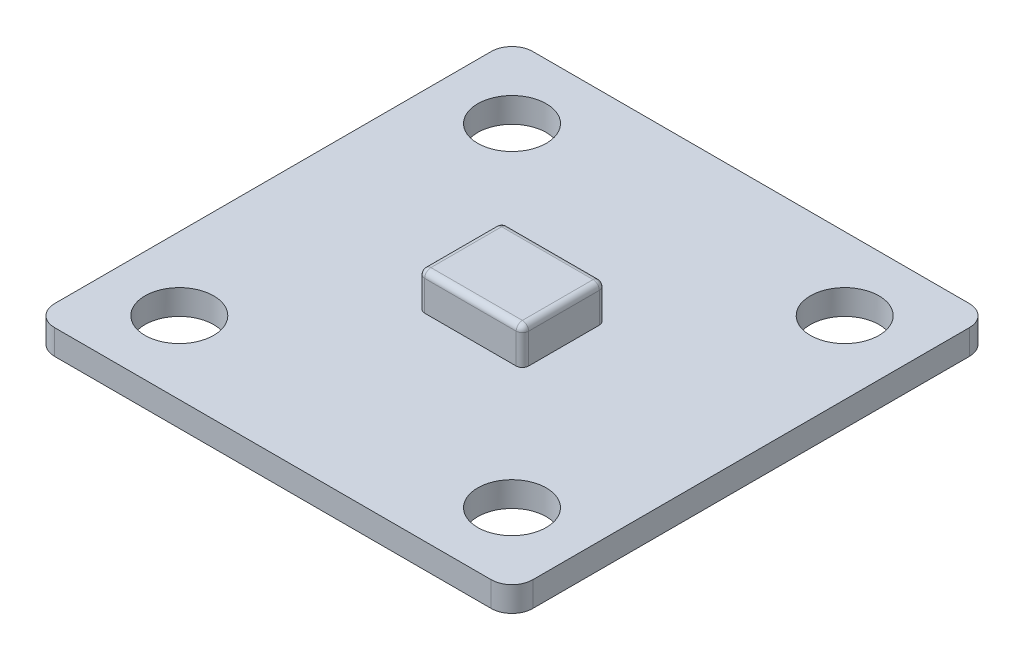
ISO-10303-21;
HEADER;
FILE_DESCRIPTION(('STEP AP214'),'2;1');
FILE_NAME('part.step','',(''),(''),'','','');
FILE_SCHEMA(('AUTOMOTIVE_DESIGN { 1 0 10303 214 1 1 1 1 }'));
ENDSEC;
DATA;
#1=APPLICATION_CONTEXT('core data for automotive mechanical design processes');
#2=APPLICATION_PROTOCOL_DEFINITION('international standard','automotive_design',2000,#1);
#3=PRODUCT_CONTEXT('',#1,'mechanical');
#4=PRODUCT('Part','Part','',(#3));
#5=PRODUCT_RELATED_PRODUCT_CATEGORY('part','',(#4));
#6=PRODUCT_DEFINITION_FORMATION('','',#4);
#7=PRODUCT_DEFINITION_CONTEXT('part definition',#1,'design');
#8=PRODUCT_DEFINITION('design','',#6,#7);
#9=PRODUCT_DEFINITION_SHAPE('','',#8);
#10=(LENGTH_UNIT() NAMED_UNIT(*) SI_UNIT(.MILLI.,.METRE.));
#11=(NAMED_UNIT(*) PLANE_ANGLE_UNIT() SI_UNIT($,.RADIAN.));
#12=(NAMED_UNIT(*) SI_UNIT($,.STERADIAN.) SOLID_ANGLE_UNIT());
#13=UNCERTAINTY_MEASURE_WITH_UNIT(LENGTH_MEASURE(1.E-05),#10,'distance_accuracy_value','');
#14=(GEOMETRIC_REPRESENTATION_CONTEXT(3) GLOBAL_UNCERTAINTY_ASSIGNED_CONTEXT((#13)) GLOBAL_UNIT_ASSIGNED_CONTEXT((#10,
#11,#12)) REPRESENTATION_CONTEXT('',''));
#15=CARTESIAN_POINT('',(0.,0.,0.));
#16=DIRECTION('',(0.,0.,1.));
#17=DIRECTION('',(1.,0.,0.));
#18=AXIS2_PLACEMENT_3D('',#15,#16,#17);
#19=CARTESIAN_POINT('',(0.,1.2,0.));
#20=DIRECTION('',(0.,-1.,0.));
#21=DIRECTION('',(0.,0.,-1.));
#22=AXIS2_PLACEMENT_3D('',#19,#20,#21);
#23=PLANE('',#22);
#24=CARTESIAN_POINT('',(-8.,1.2,8.));
#25=DIRECTION('',(0.,1.,0.));
#26=DIRECTION('',(0.,0.,1.));
#27=AXIS2_PLACEMENT_3D('',#24,#25,#26);
#28=CIRCLE('',#27,1.65);
#29=CARTESIAN_POINT('',(-8.,1.2,9.65));
#30=VERTEX_POINT('',#29);
#31=EDGE_CURVE('E343',#30,#30,#28,.T.);
#32=ORIENTED_EDGE('',*,*,#31,.F.);
#33=EDGE_LOOP('',(#32));
#34=FACE_BOUND('',#33,.T.);
#35=CARTESIAN_POINT('',(8.,1.2,8.));
#36=DIRECTION('',(0.,1.,0.));
#37=DIRECTION('',(0.,0.,1.));
#38=AXIS2_PLACEMENT_3D('',#35,#36,#37);
#39=CIRCLE('',#38,1.65);
#40=CARTESIAN_POINT('',(8.,1.2,9.65));
#41=VERTEX_POINT('',#40);
#42=EDGE_CURVE('E339',#41,#41,#39,.T.);
#43=ORIENTED_EDGE('',*,*,#42,.F.);
#44=EDGE_LOOP('',(#43));
#45=FACE_BOUND('',#44,.T.);
#46=CARTESIAN_POINT('',(8.,1.2,-8.));
#47=DIRECTION('',(0.,1.,0.));
#48=DIRECTION('',(0.,0.,1.));
#49=AXIS2_PLACEMENT_3D('',#46,#47,#48);
#50=CIRCLE('',#49,1.65);
#51=CARTESIAN_POINT('',(8.,1.2,-6.35));
#52=VERTEX_POINT('',#51);
#53=EDGE_CURVE('E336',#52,#52,#50,.T.);
#54=ORIENTED_EDGE('',*,*,#53,.F.);
#55=EDGE_LOOP('',(#54));
#56=FACE_BOUND('',#55,.T.);
#57=CARTESIAN_POINT('',(-8.,1.2,-8.));
#58=DIRECTION('',(0.,1.,0.));
#59=DIRECTION('',(0.,0.,1.));
#60=AXIS2_PLACEMENT_3D('',#57,#58,#59);
#61=CIRCLE('',#60,1.65);
#62=CARTESIAN_POINT('',(-8.,1.2,-6.35));
#63=VERTEX_POINT('',#62);
#64=EDGE_CURVE('E306',#63,#63,#61,.T.);
#65=ORIENTED_EDGE('',*,*,#64,.F.);
#66=EDGE_LOOP('',(#65));
#67=FACE_BOUND('',#66,.T.);
#68=DIRECTION('',(0.,0.,-1.));
#69=VECTOR('',#68,1.);
#70=CARTESIAN_POINT('',(11.5,1.2,11.5));
#71=LINE('',#70,#69);
#72=CARTESIAN_POINT('',(11.5,1.2,10.5));
#73=VERTEX_POINT('',#72);
#74=CARTESIAN_POINT('',(11.5,1.2,-10.5));
#75=VERTEX_POINT('',#74);
#76=EDGE_CURVE('E202',#73,#75,#71,.T.);
#77=ORIENTED_EDGE('',*,*,#76,.T.);
#78=CARTESIAN_POINT('',(10.5,1.2,-10.5));
#79=DIRECTION('',(0.,-1.,0.));
#80=DIRECTION('',(0.,0.,-1.));
#81=AXIS2_PLACEMENT_3D('',#78,#79,#80);
#82=CIRCLE('',#81,1.);
#83=CARTESIAN_POINT('',(10.5,1.2,-11.5));
#84=VERTEX_POINT('',#83);
#85=EDGE_CURVE('E218',#75,#84,#82,.F.);
#86=ORIENTED_EDGE('',*,*,#85,.T.);
#87=DIRECTION('',(-1.,0.,0.));
#88=VECTOR('',#87,1.);
#89=CARTESIAN_POINT('',(-11.5,1.2,-11.5));
#90=LINE('',#89,#88);
#91=CARTESIAN_POINT('',(-10.5,1.2,-11.5));
#92=VERTEX_POINT('',#91);
#93=EDGE_CURVE('E184',#84,#92,#90,.T.);
#94=ORIENTED_EDGE('',*,*,#93,.T.);
#95=CARTESIAN_POINT('',(-10.5,1.2,-10.5));
#96=DIRECTION('',(0.,-1.,0.));
#97=DIRECTION('',(0.,0.,-1.));
#98=AXIS2_PLACEMENT_3D('',#95,#96,#97);
#99=CIRCLE('',#98,1.);
#100=CARTESIAN_POINT('',(-11.5,1.2,-10.5));
#101=VERTEX_POINT('',#100);
#102=EDGE_CURVE('E216',#92,#101,#99,.F.);
#103=ORIENTED_EDGE('',*,*,#102,.T.);
#104=DIRECTION('',(0.,0.,1.));
#105=VECTOR('',#104,1.);
#106=CARTESIAN_POINT('',(-11.5,1.2,11.5));
#107=LINE('',#106,#105);
#108=CARTESIAN_POINT('',(-11.5,1.2,10.5));
#109=VERTEX_POINT('',#108);
#110=EDGE_CURVE('E357',#101,#109,#107,.T.);
#111=ORIENTED_EDGE('',*,*,#110,.T.);
#112=CARTESIAN_POINT('',(-10.5,1.2,10.5));
#113=DIRECTION('',(0.,-1.,0.));
#114=DIRECTION('',(0.,0.,-1.));
#115=AXIS2_PLACEMENT_3D('',#112,#113,#114);
#116=CIRCLE('',#115,1.);
#117=CARTESIAN_POINT('',(-10.5,1.2,11.5));
#118=VERTEX_POINT('',#117);
#119=EDGE_CURVE('E212',#109,#118,#116,.F.);
#120=ORIENTED_EDGE('',*,*,#119,.T.);
#121=DIRECTION('',(1.,0.,0.));
#122=VECTOR('',#121,1.);
#123=CARTESIAN_POINT('',(-11.5,1.2,11.5));
#124=LINE('',#123,#122);
#125=CARTESIAN_POINT('',(10.5,1.2,11.5));
#126=VERTEX_POINT('',#125);
#127=EDGE_CURVE('E203',#118,#126,#124,.T.);
#128=ORIENTED_EDGE('',*,*,#127,.T.);
#129=CARTESIAN_POINT('',(10.5,1.2,10.5));
#130=DIRECTION('',(0.,-1.,0.));
#131=DIRECTION('',(0.,0.,-1.));
#132=AXIS2_PLACEMENT_3D('',#129,#130,#131);
#133=CIRCLE('',#132,1.);
#134=EDGE_CURVE('E214',#126,#73,#133,.F.);
#135=ORIENTED_EDGE('',*,*,#134,.T.);
#136=EDGE_LOOP('',(#77,#86,#94,#103,#111,#120,#128,#135));
#137=FACE_BOUND('',#136,.T.);
#138=DIRECTION('',(0.,0.,-1.));
#139=VECTOR('',#138,1.);
#140=CARTESIAN_POINT('',(2.5,1.2,2.));
#141=LINE('',#140,#139);
#142=CARTESIAN_POINT('',(2.5,1.2,1.7));
#143=VERTEX_POINT('',#142);
#144=CARTESIAN_POINT('',(2.5,1.2,-1.7));
#145=VERTEX_POINT('',#144);
#146=EDGE_CURVE('E301',#143,#145,#141,.T.);
#147=ORIENTED_EDGE('',*,*,#146,.F.);
#148=CARTESIAN_POINT('',(2.2,1.2,1.7));
#149=DIRECTION('',(0.,-1.,0.));
#150=DIRECTION('',(0.,0.,-1.));
#151=AXIS2_PLACEMENT_3D('',#148,#149,#150);
#152=CIRCLE('',#151,0.3);
#153=CARTESIAN_POINT('',(2.2,1.2,2.));
#154=VERTEX_POINT('',#153);
#155=EDGE_CURVE('E11',#143,#154,#152,.T.);
#156=ORIENTED_EDGE('',*,*,#155,.T.);
#157=DIRECTION('',(1.,0.,0.));
#158=VECTOR('',#157,1.);
#159=CARTESIAN_POINT('',(-2.5,1.2,2.));
#160=LINE('',#159,#158);
#161=CARTESIAN_POINT('',(-2.2,1.2,2.));
#162=VERTEX_POINT('',#161);
#163=EDGE_CURVE('E196',#162,#154,#160,.T.);
#164=ORIENTED_EDGE('',*,*,#163,.F.);
#165=CARTESIAN_POINT('',(-2.2,1.2,1.7));
#166=DIRECTION('',(0.,-1.,0.));
#167=DIRECTION('',(0.,0.,-1.));
#168=AXIS2_PLACEMENT_3D('',#165,#166,#167);
#169=CIRCLE('',#168,0.3);
#170=CARTESIAN_POINT('',(-2.5,1.2,1.7));
#171=VERTEX_POINT('',#170);
#172=EDGE_CURVE('E264',#162,#171,#169,.T.);
#173=ORIENTED_EDGE('',*,*,#172,.T.);
#174=DIRECTION('',(0.,0.,1.));
#175=VECTOR('',#174,1.);
#176=CARTESIAN_POINT('',(-2.5,1.2,2.));
#177=LINE('',#176,#175);
#178=CARTESIAN_POINT('',(-2.5,1.2,-1.7));
#179=VERTEX_POINT('',#178);
#180=EDGE_CURVE('E349',#179,#171,#177,.T.);
#181=ORIENTED_EDGE('',*,*,#180,.F.);
#182=CARTESIAN_POINT('',(-2.2,1.2,-1.7));
#183=DIRECTION('',(0.,-1.,0.));
#184=DIRECTION('',(0.,0.,-1.));
#185=AXIS2_PLACEMENT_3D('',#182,#183,#184);
#186=CIRCLE('',#185,0.3);
#187=CARTESIAN_POINT('',(-2.2,1.2,-2.));
#188=VERTEX_POINT('',#187);
#189=EDGE_CURVE('E262',#179,#188,#186,.T.);
#190=ORIENTED_EDGE('',*,*,#189,.T.);
#191=DIRECTION('',(-1.,0.,0.));
#192=VECTOR('',#191,1.);
#193=CARTESIAN_POINT('',(-2.5,1.2,-2.));
#194=LINE('',#193,#192);
#195=CARTESIAN_POINT('',(2.2,1.2,-2.));
#196=VERTEX_POINT('',#195);
#197=EDGE_CURVE('E346',#196,#188,#194,.T.);
#198=ORIENTED_EDGE('',*,*,#197,.F.);
#199=CARTESIAN_POINT('',(2.2,1.2,-1.7));
#200=DIRECTION('',(0.,-1.,0.));
#201=DIRECTION('',(0.,0.,-1.));
#202=AXIS2_PLACEMENT_3D('',#199,#200,#201);
#203=CIRCLE('',#202,0.3);
#204=EDGE_CURVE('E47',#196,#145,#203,.T.);
#205=ORIENTED_EDGE('',*,*,#204,.T.);
#206=EDGE_LOOP('',(#147,#156,#164,#173,#181,#190,#198,#205));
#207=FACE_BOUND('',#206,.T.);
#208=ADVANCED_FACE('F38',(#34,#45,#56,#67,#137,#207),#23,.F.);
#209=CARTESIAN_POINT('',(11.5,1.2,11.5));
#210=DIRECTION('',(-1.,0.,0.));
#211=DIRECTION('',(0.,0.,1.));
#212=AXIS2_PLACEMENT_3D('',#209,#210,#211);
#213=PLANE('',#212);
#214=DIRECTION('',(0.,0.,-1.));
#215=VECTOR('',#214,1.);
#216=CARTESIAN_POINT('',(11.5,0.,11.5));
#217=LINE('',#216,#215);
#218=CARTESIAN_POINT('',(11.5,0.,10.5));
#219=VERTEX_POINT('',#218);
#220=CARTESIAN_POINT('',(11.5,0.,-10.5));
#221=VERTEX_POINT('',#220);
#222=EDGE_CURVE('E191',#219,#221,#217,.T.);
#223=ORIENTED_EDGE('',*,*,#222,.T.);
#224=DIRECTION('',(0.,-1.,0.));
#225=VECTOR('',#224,1.);
#226=CARTESIAN_POINT('',(11.5,1.2,-10.5));
#227=LINE('',#226,#225);
#228=EDGE_CURVE('E169',#221,#75,#227,.F.);
#229=ORIENTED_EDGE('',*,*,#228,.T.);
#230=ORIENTED_EDGE('',*,*,#76,.F.);
#231=DIRECTION('',(0.,-1.,0.));
#232=VECTOR('',#231,1.);
#233=CARTESIAN_POINT('',(11.5,1.2,10.5));
#234=LINE('',#233,#232);
#235=EDGE_CURVE('E174',#73,#219,#234,.T.);
#236=ORIENTED_EDGE('',*,*,#235,.T.);
#237=EDGE_LOOP('',(#223,#229,#230,#236));
#238=FACE_BOUND('',#237,.T.);
#239=ADVANCED_FACE('F373',(#238),#213,.F.);
#240=CARTESIAN_POINT('',(-11.5,1.2,-11.5));
#241=DIRECTION('',(0.,0.,1.));
#242=DIRECTION('',(1.,0.,0.));
#243=AXIS2_PLACEMENT_3D('',#240,#241,#242);
#244=PLANE('',#243);
#245=ORIENTED_EDGE('',*,*,#93,.F.);
#246=DIRECTION('',(0.,-1.,0.));
#247=VECTOR('',#246,1.);
#248=CARTESIAN_POINT('',(10.5,1.2,-11.5));
#249=LINE('',#248,#247);
#250=CARTESIAN_POINT('',(10.5,0.,-11.5));
#251=VERTEX_POINT('',#250);
#252=EDGE_CURVE('E168',#84,#251,#249,.T.);
#253=ORIENTED_EDGE('',*,*,#252,.T.);
#254=DIRECTION('',(-1.,0.,0.));
#255=VECTOR('',#254,1.);
#256=CARTESIAN_POINT('',(-11.5,0.,-11.5));
#257=LINE('',#256,#255);
#258=CARTESIAN_POINT('',(-10.5,0.,-11.5));
#259=VERTEX_POINT('',#258);
#260=EDGE_CURVE('E181',#251,#259,#257,.T.);
#261=ORIENTED_EDGE('',*,*,#260,.T.);
#262=DIRECTION('',(0.,-1.,0.));
#263=VECTOR('',#262,1.);
#264=CARTESIAN_POINT('',(-10.5,1.2,-11.5));
#265=LINE('',#264,#263);
#266=EDGE_CURVE('E186',#259,#92,#265,.F.);
#267=ORIENTED_EDGE('',*,*,#266,.T.);
#268=EDGE_LOOP('',(#245,#253,#261,#267));
#269=FACE_BOUND('',#268,.T.);
#270=ADVANCED_FACE('F180',(#269),#244,.F.);
#271=CARTESIAN_POINT('',(-11.5,1.2,11.5));
#272=DIRECTION('',(1.,0.,0.));
#273=DIRECTION('',(0.,0.,-1.));
#274=AXIS2_PLACEMENT_3D('',#271,#272,#273);
#275=PLANE('',#274);
#276=ORIENTED_EDGE('',*,*,#110,.F.);
#277=DIRECTION('',(0.,-1.,0.));
#278=VECTOR('',#277,1.);
#279=CARTESIAN_POINT('',(-11.5,1.2,-10.5));
#280=LINE('',#279,#278);
#281=CARTESIAN_POINT('',(-11.5,0.,-10.5));
#282=VERTEX_POINT('',#281);
#283=EDGE_CURVE('E222',#101,#282,#280,.T.);
#284=ORIENTED_EDGE('',*,*,#283,.T.);
#285=DIRECTION('',(0.,0.,1.));
#286=VECTOR('',#285,1.);
#287=CARTESIAN_POINT('',(-11.5,0.,11.5));
#288=LINE('',#287,#286);
#289=CARTESIAN_POINT('',(-11.5,0.,10.5));
#290=VERTEX_POINT('',#289);
#291=EDGE_CURVE('E190',#282,#290,#288,.T.);
#292=ORIENTED_EDGE('',*,*,#291,.T.);
#293=DIRECTION('',(0.,-1.,0.));
#294=VECTOR('',#293,1.);
#295=CARTESIAN_POINT('',(-11.5,1.2,10.5));
#296=LINE('',#295,#294);
#297=EDGE_CURVE('E220',#290,#109,#296,.F.);
#298=ORIENTED_EDGE('',*,*,#297,.T.);
#299=EDGE_LOOP('',(#276,#284,#292,#298));
#300=FACE_BOUND('',#299,.T.);
#301=ADVANCED_FACE('F380',(#300),#275,.F.);
#302=CARTESIAN_POINT('',(-11.5,1.2,11.5));
#303=DIRECTION('',(0.,0.,-1.));
#304=DIRECTION('',(-1.,0.,0.));
#305=AXIS2_PLACEMENT_3D('',#302,#303,#304);
#306=PLANE('',#305);
#307=DIRECTION('',(1.,0.,0.));
#308=VECTOR('',#307,1.);
#309=CARTESIAN_POINT('',(-11.5,0.,11.5));
#310=LINE('',#309,#308);
#311=CARTESIAN_POINT('',(-10.5,0.,11.5));
#312=VERTEX_POINT('',#311);
#313=CARTESIAN_POINT('',(10.5,0.,11.5));
#314=VERTEX_POINT('',#313);
#315=EDGE_CURVE('E194',#312,#314,#310,.T.);
#316=ORIENTED_EDGE('',*,*,#315,.T.);
#317=DIRECTION('',(0.,-1.,0.));
#318=VECTOR('',#317,1.);
#319=CARTESIAN_POINT('',(10.5,1.2,11.5));
#320=LINE('',#319,#318);
#321=EDGE_CURVE('E228',#314,#126,#320,.F.);
#322=ORIENTED_EDGE('',*,*,#321,.T.);
#323=ORIENTED_EDGE('',*,*,#127,.F.);
#324=DIRECTION('',(0.,-1.,0.));
#325=VECTOR('',#324,1.);
#326=CARTESIAN_POINT('',(-10.5,1.2,11.5));
#327=LINE('',#326,#325);
#328=EDGE_CURVE('E225',#118,#312,#327,.T.);
#329=ORIENTED_EDGE('',*,*,#328,.T.);
#330=EDGE_LOOP('',(#316,#322,#323,#329));
#331=FACE_BOUND('',#330,.T.);
#332=ADVANCED_FACE('F320',(#331),#306,.F.);
#333=CARTESIAN_POINT('',(0.,0.,0.));
#334=DIRECTION('',(0.,-1.,0.));
#335=DIRECTION('',(0.,0.,-1.));
#336=AXIS2_PLACEMENT_3D('',#333,#334,#335);
#337=PLANE('',#336);
#338=CARTESIAN_POINT('',(-8.,0.,8.));
#339=DIRECTION('',(0.,-1.,0.));
#340=DIRECTION('',(0.,0.,-1.));
#341=AXIS2_PLACEMENT_3D('',#338,#339,#340);
#342=CIRCLE('',#341,1.65);
#343=CARTESIAN_POINT('',(-8.,0.,6.35));
#344=VERTEX_POINT('',#343);
#345=EDGE_CURVE('E42',#344,#344,#342,.T.);
#346=ORIENTED_EDGE('',*,*,#345,.F.);
#347=EDGE_LOOP('',(#346));
#348=FACE_BOUND('',#347,.T.);
#349=CARTESIAN_POINT('',(8.,0.,8.));
#350=DIRECTION('',(0.,-1.,0.));
#351=DIRECTION('',(0.,0.,-1.));
#352=AXIS2_PLACEMENT_3D('',#349,#350,#351);
#353=CIRCLE('',#352,1.65);
#354=CARTESIAN_POINT('',(8.,0.,6.35));
#355=VERTEX_POINT('',#354);
#356=EDGE_CURVE('E308',#355,#355,#353,.T.);
#357=ORIENTED_EDGE('',*,*,#356,.F.);
#358=EDGE_LOOP('',(#357));
#359=FACE_BOUND('',#358,.T.);
#360=CARTESIAN_POINT('',(8.,0.,-8.));
#361=DIRECTION('',(0.,-1.,0.));
#362=DIRECTION('',(0.,0.,-1.));
#363=AXIS2_PLACEMENT_3D('',#360,#361,#362);
#364=CIRCLE('',#363,1.65);
#365=CARTESIAN_POINT('',(8.,0.,-9.65));
#366=VERTEX_POINT('',#365);
#367=EDGE_CURVE('E305',#366,#366,#364,.T.);
#368=ORIENTED_EDGE('',*,*,#367,.F.);
#369=EDGE_LOOP('',(#368));
#370=FACE_BOUND('',#369,.T.);
#371=CARTESIAN_POINT('',(-8.,0.,-8.));
#372=DIRECTION('',(0.,-1.,0.));
#373=DIRECTION('',(0.,0.,-1.));
#374=AXIS2_PLACEMENT_3D('',#371,#372,#373);
#375=CIRCLE('',#374,1.65);
#376=CARTESIAN_POINT('',(-8.,0.,-9.65));
#377=VERTEX_POINT('',#376);
#378=EDGE_CURVE('E302',#377,#377,#375,.T.);
#379=ORIENTED_EDGE('',*,*,#378,.F.);
#380=EDGE_LOOP('',(#379));
#381=FACE_BOUND('',#380,.T.);
#382=ORIENTED_EDGE('',*,*,#260,.F.);
#383=CARTESIAN_POINT('',(10.5,0.,-10.5));
#384=DIRECTION('',(0.,-1.,0.));
#385=DIRECTION('',(0.,0.,-1.));
#386=AXIS2_PLACEMENT_3D('',#383,#384,#385);
#387=CIRCLE('',#386,1.);
#388=EDGE_CURVE('E164',#251,#221,#387,.T.);
#389=ORIENTED_EDGE('',*,*,#388,.T.);
#390=ORIENTED_EDGE('',*,*,#222,.F.);
#391=CARTESIAN_POINT('',(10.5,0.,10.5));
#392=DIRECTION('',(0.,-1.,0.));
#393=DIRECTION('',(0.,0.,-1.));
#394=AXIS2_PLACEMENT_3D('',#391,#392,#393);
#395=CIRCLE('',#394,1.);
#396=EDGE_CURVE('E206',#219,#314,#395,.T.);
#397=ORIENTED_EDGE('',*,*,#396,.T.);
#398=ORIENTED_EDGE('',*,*,#315,.F.);
#399=CARTESIAN_POINT('',(-10.5,0.,10.5));
#400=DIRECTION('',(0.,-1.,0.));
#401=DIRECTION('',(0.,0.,-1.));
#402=AXIS2_PLACEMENT_3D('',#399,#400,#401);
#403=CIRCLE('',#402,1.);
#404=EDGE_CURVE('E185',#312,#290,#403,.T.);
#405=ORIENTED_EDGE('',*,*,#404,.T.);
#406=ORIENTED_EDGE('',*,*,#291,.F.);
#407=CARTESIAN_POINT('',(-10.5,0.,-10.5));
#408=DIRECTION('',(0.,-1.,0.));
#409=DIRECTION('',(0.,0.,-1.));
#410=AXIS2_PLACEMENT_3D('',#407,#408,#409);
#411=CIRCLE('',#410,1.);
#412=EDGE_CURVE('E175',#282,#259,#411,.T.);
#413=ORIENTED_EDGE('',*,*,#412,.T.);
#414=EDGE_LOOP('',(#382,#389,#390,#397,#398,#405,#406,#413));
#415=FACE_BOUND('',#414,.T.);
#416=ADVANCED_FACE('F188',(#348,#359,#370,#381,#415),#337,.T.);
#417=CARTESIAN_POINT('',(10.5,1.2,-10.5));
#418=DIRECTION('',(0.,-1.,0.));
#419=DIRECTION('',(0.,0.,-1.));
#420=AXIS2_PLACEMENT_3D('',#417,#418,#419);
#421=CYLINDRICAL_SURFACE('',#420,1.);
#422=ORIENTED_EDGE('',*,*,#85,.F.);
#423=ORIENTED_EDGE('',*,*,#228,.F.);
#424=ORIENTED_EDGE('',*,*,#388,.F.);
#425=ORIENTED_EDGE('',*,*,#252,.F.);
#426=EDGE_LOOP('',(#422,#423,#424,#425));
#427=FACE_BOUND('',#426,.T.);
#428=ADVANCED_FACE('F167',(#427),#421,.T.);
#429=CARTESIAN_POINT('',(-10.5,1.2,-10.5));
#430=DIRECTION('',(0.,-1.,0.));
#431=DIRECTION('',(0.,0.,-1.));
#432=AXIS2_PLACEMENT_3D('',#429,#430,#431);
#433=CYLINDRICAL_SURFACE('',#432,1.);
#434=ORIENTED_EDGE('',*,*,#102,.F.);
#435=ORIENTED_EDGE('',*,*,#266,.F.);
#436=ORIENTED_EDGE('',*,*,#412,.F.);
#437=ORIENTED_EDGE('',*,*,#283,.F.);
#438=EDGE_LOOP('',(#434,#435,#436,#437));
#439=FACE_BOUND('',#438,.T.);
#440=ADVANCED_FACE('F384',(#439),#433,.T.);
#441=CARTESIAN_POINT('',(10.5,1.2,10.5));
#442=DIRECTION('',(0.,-1.,0.));
#443=DIRECTION('',(0.,0.,-1.));
#444=AXIS2_PLACEMENT_3D('',#441,#442,#443);
#445=CYLINDRICAL_SURFACE('',#444,1.);
#446=ORIENTED_EDGE('',*,*,#134,.F.);
#447=ORIENTED_EDGE('',*,*,#321,.F.);
#448=ORIENTED_EDGE('',*,*,#396,.F.);
#449=ORIENTED_EDGE('',*,*,#235,.F.);
#450=EDGE_LOOP('',(#446,#447,#448,#449));
#451=FACE_BOUND('',#450,.T.);
#452=ADVANCED_FACE('F371',(#451),#445,.T.);
#453=CARTESIAN_POINT('',(-10.5,1.2,10.5));
#454=DIRECTION('',(0.,-1.,0.));
#455=DIRECTION('',(0.,0.,-1.));
#456=AXIS2_PLACEMENT_3D('',#453,#454,#455);
#457=CYLINDRICAL_SURFACE('',#456,1.);
#458=ORIENTED_EDGE('',*,*,#119,.F.);
#459=ORIENTED_EDGE('',*,*,#297,.F.);
#460=ORIENTED_EDGE('',*,*,#404,.F.);
#461=ORIENTED_EDGE('',*,*,#328,.F.);
#462=EDGE_LOOP('',(#458,#459,#460,#461));
#463=FACE_BOUND('',#462,.T.);
#464=ADVANCED_FACE('F376',(#463),#457,.T.);
#465=CARTESIAN_POINT('',(2.5,2.95,2.));
#466=DIRECTION('',(-1.,0.,0.));
#467=DIRECTION('',(0.,0.,1.));
#468=AXIS2_PLACEMENT_3D('',#465,#466,#467);
#469=PLANE('',#468);
#470=ORIENTED_EDGE('',*,*,#146,.T.);
#471=DIRECTION('',(0.,-1.,0.));
#472=VECTOR('',#471,1.);
#473=CARTESIAN_POINT('',(2.5,2.95,-1.7));
#474=LINE('',#473,#472);
#475=CARTESIAN_POINT('',(2.5,2.65,-1.7));
#476=VERTEX_POINT('',#475);
#477=EDGE_CURVE('E55',#145,#476,#474,.F.);
#478=ORIENTED_EDGE('',*,*,#477,.T.);
#479=DIRECTION('',(0.,0.,-1.));
#480=VECTOR('',#479,1.);
#481=CARTESIAN_POINT('',(2.5,2.65,2.));
#482=LINE('',#481,#480);
#483=CARTESIAN_POINT('',(2.5,2.65,1.7));
#484=VERTEX_POINT('',#483);
#485=EDGE_CURVE('E60',#476,#484,#482,.F.);
#486=ORIENTED_EDGE('',*,*,#485,.T.);
#487=DIRECTION('',(0.,-1.,0.));
#488=VECTOR('',#487,1.);
#489=CARTESIAN_POINT('',(2.5,2.95,1.7));
#490=LINE('',#489,#488);
#491=EDGE_CURVE('E258',#484,#143,#490,.T.);
#492=ORIENTED_EDGE('',*,*,#491,.T.);
#493=EDGE_LOOP('',(#470,#478,#486,#492));
#494=FACE_BOUND('',#493,.T.);
#495=ADVANCED_FACE('F404',(#494),#469,.F.);
#496=CARTESIAN_POINT('',(-2.5,2.95,-2.));
#497=DIRECTION('',(0.,0.,1.));
#498=DIRECTION('',(1.,0.,0.));
#499=AXIS2_PLACEMENT_3D('',#496,#497,#498);
#500=PLANE('',#499);
#501=ORIENTED_EDGE('',*,*,#197,.T.);
#502=DIRECTION('',(0.,-1.,0.));
#503=VECTOR('',#502,1.);
#504=CARTESIAN_POINT('',(-2.2,2.95,-2.));
#505=LINE('',#504,#503);
#506=CARTESIAN_POINT('',(-2.2,2.65,-2.));
#507=VERTEX_POINT('',#506);
#508=EDGE_CURVE('E256',#188,#507,#505,.F.);
#509=ORIENTED_EDGE('',*,*,#508,.T.);
#510=DIRECTION('',(-1.,0.,0.));
#511=VECTOR('',#510,1.);
#512=CARTESIAN_POINT('',(-2.5,2.65,-2.));
#513=LINE('',#512,#511);
#514=CARTESIAN_POINT('',(2.2,2.65,-2.));
#515=VERTEX_POINT('',#514);
#516=EDGE_CURVE('E254',#507,#515,#513,.F.);
#517=ORIENTED_EDGE('',*,*,#516,.T.);
#518=DIRECTION('',(0.,-1.,0.));
#519=VECTOR('',#518,1.);
#520=CARTESIAN_POINT('',(2.2,2.95,-2.));
#521=LINE('',#520,#519);
#522=EDGE_CURVE('E252',#515,#196,#521,.T.);
#523=ORIENTED_EDGE('',*,*,#522,.T.);
#524=EDGE_LOOP('',(#501,#509,#517,#523));
#525=FACE_BOUND('',#524,.T.);
#526=ADVANCED_FACE('F468',(#525),#500,.F.);
#527=CARTESIAN_POINT('',(-2.5,2.95,2.));
#528=DIRECTION('',(1.,0.,0.));
#529=DIRECTION('',(0.,0.,-1.));
#530=AXIS2_PLACEMENT_3D('',#527,#528,#529);
#531=PLANE('',#530);
#532=DIRECTION('',(0.,0.,1.));
#533=VECTOR('',#532,1.);
#534=CARTESIAN_POINT('',(-2.5,2.65,2.));
#535=LINE('',#534,#533);
#536=CARTESIAN_POINT('',(-2.5,2.65,1.7));
#537=VERTEX_POINT('',#536);
#538=CARTESIAN_POINT('',(-2.5,2.65,-1.7));
#539=VERTEX_POINT('',#538);
#540=EDGE_CURVE('E248',#537,#539,#535,.F.);
#541=ORIENTED_EDGE('',*,*,#540,.T.);
#542=DIRECTION('',(0.,-1.,0.));
#543=VECTOR('',#542,1.);
#544=CARTESIAN_POINT('',(-2.5,2.95,-1.7));
#545=LINE('',#544,#543);
#546=EDGE_CURVE('E250',#539,#179,#545,.T.);
#547=ORIENTED_EDGE('',*,*,#546,.T.);
#548=ORIENTED_EDGE('',*,*,#180,.T.);
#549=DIRECTION('',(0.,-1.,0.));
#550=VECTOR('',#549,1.);
#551=CARTESIAN_POINT('',(-2.5,2.95,1.7));
#552=LINE('',#551,#550);
#553=EDGE_CURVE('E246',#171,#537,#552,.F.);
#554=ORIENTED_EDGE('',*,*,#553,.T.);
#555=EDGE_LOOP('',(#541,#547,#548,#554));
#556=FACE_BOUND('',#555,.T.);
#557=ADVANCED_FACE('F477',(#556),#531,.F.);
#558=CARTESIAN_POINT('',(-2.5,2.95,2.));
#559=DIRECTION('',(0.,0.,-1.));
#560=DIRECTION('',(-1.,0.,0.));
#561=AXIS2_PLACEMENT_3D('',#558,#559,#560);
#562=PLANE('',#561);
#563=DIRECTION('',(1.,0.,0.));
#564=VECTOR('',#563,1.);
#565=CARTESIAN_POINT('',(-2.5,2.65,2.));
#566=LINE('',#565,#564);
#567=CARTESIAN_POINT('',(2.2,2.65,2.));
#568=VERTEX_POINT('',#567);
#569=CARTESIAN_POINT('',(-2.2,2.65,2.));
#570=VERTEX_POINT('',#569);
#571=EDGE_CURVE('E241',#568,#570,#566,.F.);
#572=ORIENTED_EDGE('',*,*,#571,.T.);
#573=DIRECTION('',(0.,-1.,0.));
#574=VECTOR('',#573,1.);
#575=CARTESIAN_POINT('',(-2.2,2.95,2.));
#576=LINE('',#575,#574);
#577=EDGE_CURVE('E244',#570,#162,#576,.T.);
#578=ORIENTED_EDGE('',*,*,#577,.T.);
#579=ORIENTED_EDGE('',*,*,#163,.T.);
#580=DIRECTION('',(0.,-1.,0.));
#581=VECTOR('',#580,1.);
#582=CARTESIAN_POINT('',(2.2,2.95,2.));
#583=LINE('',#582,#581);
#584=EDGE_CURVE('E239',#154,#568,#583,.F.);
#585=ORIENTED_EDGE('',*,*,#584,.T.);
#586=EDGE_LOOP('',(#572,#578,#579,#585));
#587=FACE_BOUND('',#586,.T.);
#588=ADVANCED_FACE('F487',(#587),#562,.F.);
#589=CARTESIAN_POINT('',(0.,2.95,0.));
#590=DIRECTION('',(0.,-1.,0.));
#591=DIRECTION('',(0.,0.,-1.));
#592=AXIS2_PLACEMENT_3D('',#589,#590,#591);
#593=PLANE('',#592);
#594=DIRECTION('',(0.,0.,1.));
#595=VECTOR('',#594,1.);
#596=CARTESIAN_POINT('',(-2.2,2.95,0.));
#597=LINE('',#596,#595);
#598=CARTESIAN_POINT('',(-2.2,2.95,-1.7));
#599=VERTEX_POINT('',#598);
#600=CARTESIAN_POINT('',(-2.2,2.95,1.7));
#601=VERTEX_POINT('',#600);
#602=EDGE_CURVE('E234',#599,#601,#597,.T.);
#603=ORIENTED_EDGE('',*,*,#602,.T.);
#604=DIRECTION('',(1.,0.,0.));
#605=VECTOR('',#604,1.);
#606=CARTESIAN_POINT('',(0.,2.95,1.7));
#607=LINE('',#606,#605);
#608=CARTESIAN_POINT('',(2.2,2.95,1.7));
#609=VERTEX_POINT('',#608);
#610=EDGE_CURVE('E236',#601,#609,#607,.T.);
#611=ORIENTED_EDGE('',*,*,#610,.T.);
#612=DIRECTION('',(0.,0.,-1.));
#613=VECTOR('',#612,1.);
#614=CARTESIAN_POINT('',(2.2,2.95,0.));
#615=LINE('',#614,#613);
#616=CARTESIAN_POINT('',(2.2,2.95,-1.7));
#617=VERTEX_POINT('',#616);
#618=EDGE_CURVE('E230',#609,#617,#615,.T.);
#619=ORIENTED_EDGE('',*,*,#618,.T.);
#620=DIRECTION('',(-1.,0.,0.));
#621=VECTOR('',#620,1.);
#622=CARTESIAN_POINT('',(0.,2.95,-1.7));
#623=LINE('',#622,#621);
#624=EDGE_CURVE('E232',#617,#599,#623,.T.);
#625=ORIENTED_EDGE('',*,*,#624,.T.);
#626=EDGE_LOOP('',(#603,#611,#619,#625));
#627=FACE_BOUND('',#626,.T.);
#628=ADVANCED_FACE('F498',(#627),#593,.F.);
#629=CARTESIAN_POINT('',(-2.2,2.95,-1.7));
#630=DIRECTION('',(0.,-1.,0.));
#631=DIRECTION('',(0.,0.,-1.));
#632=AXIS2_PLACEMENT_3D('',#629,#630,#631);
#633=CYLINDRICAL_SURFACE('',#632,0.3);
#634=ORIENTED_EDGE('',*,*,#189,.F.);
#635=ORIENTED_EDGE('',*,*,#546,.F.);
#636=CARTESIAN_POINT('',(-2.2,2.65,-1.7));
#637=DIRECTION('',(0.,1.,0.));
#638=DIRECTION('',(0.,0.,1.));
#639=AXIS2_PLACEMENT_3D('',#636,#637,#638);
#640=CIRCLE('',#639,0.3);
#641=EDGE_CURVE('E298',#507,#539,#640,.T.);
#642=ORIENTED_EDGE('',*,*,#641,.F.);
#643=ORIENTED_EDGE('',*,*,#508,.F.);
#644=EDGE_LOOP('',(#634,#635,#642,#643));
#645=FACE_BOUND('',#644,.T.);
#646=ADVANCED_FACE('F40',(#645),#633,.T.);
#647=CARTESIAN_POINT('',(0.,2.65,-1.7));
#648=DIRECTION('',(-1.,0.,0.));
#649=DIRECTION('',(0.,0.,1.));
#650=AXIS2_PLACEMENT_3D('',#647,#648,#649);
#651=CYLINDRICAL_SURFACE('',#650,0.3);
#652=CARTESIAN_POINT('',(2.2,2.65,-1.7));
#653=DIRECTION('',(1.,0.,0.));
#654=DIRECTION('',(0.,0.,-1.));
#655=AXIS2_PLACEMENT_3D('',#652,#653,#654);
#656=CIRCLE('',#655,0.3);
#657=EDGE_CURVE('E292',#515,#617,#656,.T.);
#658=ORIENTED_EDGE('',*,*,#657,.F.);
#659=ORIENTED_EDGE('',*,*,#516,.F.);
#660=CARTESIAN_POINT('',(-2.2,2.65,-1.7));
#661=DIRECTION('',(-1.,0.,0.));
#662=DIRECTION('',(0.,0.,1.));
#663=AXIS2_PLACEMENT_3D('',#660,#661,#662);
#664=CIRCLE('',#663,0.3);
#665=EDGE_CURVE('E295',#599,#507,#664,.T.);
#666=ORIENTED_EDGE('',*,*,#665,.F.);
#667=ORIENTED_EDGE('',*,*,#624,.F.);
#668=EDGE_LOOP('',(#658,#659,#666,#667));
#669=FACE_BOUND('',#668,.T.);
#670=ADVANCED_FACE('F519',(#669),#651,.T.);
#671=CARTESIAN_POINT('',(2.2,2.95,-1.7));
#672=DIRECTION('',(0.,-1.,0.));
#673=DIRECTION('',(0.,0.,-1.));
#674=AXIS2_PLACEMENT_3D('',#671,#672,#673);
#675=CYLINDRICAL_SURFACE('',#674,0.3);
#676=ORIENTED_EDGE('',*,*,#204,.F.);
#677=ORIENTED_EDGE('',*,*,#522,.F.);
#678=CARTESIAN_POINT('',(2.2,2.65,-1.7));
#679=DIRECTION('',(0.,1.,0.));
#680=DIRECTION('',(0.,0.,1.));
#681=AXIS2_PLACEMENT_3D('',#678,#679,#680);
#682=CIRCLE('',#681,0.3);
#683=EDGE_CURVE('E289',#476,#515,#682,.T.);
#684=ORIENTED_EDGE('',*,*,#683,.F.);
#685=ORIENTED_EDGE('',*,*,#477,.F.);
#686=EDGE_LOOP('',(#676,#677,#684,#685));
#687=FACE_BOUND('',#686,.T.);
#688=ADVANCED_FACE('F529',(#687),#675,.T.);
#689=CARTESIAN_POINT('',(-2.2,2.65,-1.7));
#690=DIRECTION('',(0.,0.,-1.));
#691=DIRECTION('',(-1.,0.,0.));
#692=AXIS2_PLACEMENT_3D('',#689,#690,#691);
#693=SPHERICAL_SURFACE('',#692,0.3);
#694=ORIENTED_EDGE('',*,*,#665,.T.);
#695=ORIENTED_EDGE('',*,*,#641,.T.);
#696=CARTESIAN_POINT('',(-2.2,2.65,-1.7));
#697=DIRECTION('',(0.,0.,-1.));
#698=DIRECTION('',(-1.,0.,0.));
#699=AXIS2_PLACEMENT_3D('',#696,#697,#698);
#700=CIRCLE('',#699,0.3);
#701=EDGE_CURVE('E286',#599,#539,#700,.F.);
#702=ORIENTED_EDGE('',*,*,#701,.F.);
#703=EDGE_LOOP('',(#694,#695,#702));
#704=FACE_BOUND('',#703,.T.);
#705=ADVANCED_FACE('F539',(#704),#693,.T.);
#706=CARTESIAN_POINT('',(2.2,2.65,-1.7));
#707=DIRECTION('',(0.,0.,-1.));
#708=DIRECTION('',(-1.,0.,0.));
#709=AXIS2_PLACEMENT_3D('',#706,#707,#708);
#710=SPHERICAL_SURFACE('',#709,0.3);
#711=ORIENTED_EDGE('',*,*,#683,.T.);
#712=ORIENTED_EDGE('',*,*,#657,.T.);
#713=CARTESIAN_POINT('',(2.2,2.65,-1.7));
#714=DIRECTION('',(0.,0.,-1.));
#715=DIRECTION('',(-1.,0.,0.));
#716=AXIS2_PLACEMENT_3D('',#713,#714,#715);
#717=CIRCLE('',#716,0.3);
#718=EDGE_CURVE('E283',#476,#617,#717,.F.);
#719=ORIENTED_EDGE('',*,*,#718,.F.);
#720=EDGE_LOOP('',(#711,#712,#719));
#721=FACE_BOUND('',#720,.T.);
#722=ADVANCED_FACE('F550',(#721),#710,.T.);
#723=CARTESIAN_POINT('',(-2.2,2.95,1.7));
#724=DIRECTION('',(0.,-1.,0.));
#725=DIRECTION('',(0.,0.,-1.));
#726=AXIS2_PLACEMENT_3D('',#723,#724,#725);
#727=CYLINDRICAL_SURFACE('',#726,0.3);
#728=ORIENTED_EDGE('',*,*,#172,.F.);
#729=ORIENTED_EDGE('',*,*,#577,.F.);
#730=CARTESIAN_POINT('',(-2.2,2.65,1.7));
#731=DIRECTION('',(0.,1.,0.));
#732=DIRECTION('',(0.,0.,1.));
#733=AXIS2_PLACEMENT_3D('',#730,#731,#732);
#734=CIRCLE('',#733,0.3);
#735=EDGE_CURVE('E280',#537,#570,#734,.T.);
#736=ORIENTED_EDGE('',*,*,#735,.F.);
#737=ORIENTED_EDGE('',*,*,#553,.F.);
#738=EDGE_LOOP('',(#728,#729,#736,#737));
#739=FACE_BOUND('',#738,.T.);
#740=ADVANCED_FACE('F561',(#739),#727,.T.);
#741=CARTESIAN_POINT('',(-2.2,2.65,0.));
#742=DIRECTION('',(0.,0.,1.));
#743=DIRECTION('',(1.,0.,0.));
#744=AXIS2_PLACEMENT_3D('',#741,#742,#743);
#745=CYLINDRICAL_SURFACE('',#744,0.3);
#746=ORIENTED_EDGE('',*,*,#701,.T.);
#747=ORIENTED_EDGE('',*,*,#540,.F.);
#748=CARTESIAN_POINT('',(-2.2,2.65,1.7));
#749=DIRECTION('',(0.,0.,1.));
#750=DIRECTION('',(1.,0.,0.));
#751=AXIS2_PLACEMENT_3D('',#748,#749,#750);
#752=CIRCLE('',#751,0.3);
#753=EDGE_CURVE('E277',#601,#537,#752,.T.);
#754=ORIENTED_EDGE('',*,*,#753,.F.);
#755=ORIENTED_EDGE('',*,*,#602,.F.);
#756=EDGE_LOOP('',(#746,#747,#754,#755));
#757=FACE_BOUND('',#756,.T.);
#758=ADVANCED_FACE('F572',(#757),#745,.T.);
#759=CARTESIAN_POINT('',(2.2,2.65,0.));
#760=DIRECTION('',(0.,0.,-1.));
#761=DIRECTION('',(-1.,0.,0.));
#762=AXIS2_PLACEMENT_3D('',#759,#760,#761);
#763=CYLINDRICAL_SURFACE('',#762,0.3);
#764=ORIENTED_EDGE('',*,*,#718,.T.);
#765=ORIENTED_EDGE('',*,*,#618,.F.);
#766=CARTESIAN_POINT('',(2.2,2.65,1.7));
#767=DIRECTION('',(0.,0.,1.));
#768=DIRECTION('',(1.,0.,0.));
#769=AXIS2_PLACEMENT_3D('',#766,#767,#768);
#770=CIRCLE('',#769,0.3);
#771=EDGE_CURVE('E274',#484,#609,#770,.T.);
#772=ORIENTED_EDGE('',*,*,#771,.F.);
#773=ORIENTED_EDGE('',*,*,#485,.F.);
#774=EDGE_LOOP('',(#764,#765,#772,#773));
#775=FACE_BOUND('',#774,.T.);
#776=ADVANCED_FACE('F583',(#775),#763,.T.);
#777=CARTESIAN_POINT('',(2.2,2.95,1.7));
#778=DIRECTION('',(0.,-1.,0.));
#779=DIRECTION('',(0.,0.,-1.));
#780=AXIS2_PLACEMENT_3D('',#777,#778,#779);
#781=CYLINDRICAL_SURFACE('',#780,0.3);
#782=ORIENTED_EDGE('',*,*,#155,.F.);
#783=ORIENTED_EDGE('',*,*,#491,.F.);
#784=CARTESIAN_POINT('',(2.2,2.65,1.7));
#785=DIRECTION('',(0.,1.,0.));
#786=DIRECTION('',(0.,0.,1.));
#787=AXIS2_PLACEMENT_3D('',#784,#785,#786);
#788=CIRCLE('',#787,0.3);
#789=EDGE_CURVE('E271',#568,#484,#788,.T.);
#790=ORIENTED_EDGE('',*,*,#789,.F.);
#791=ORIENTED_EDGE('',*,*,#584,.F.);
#792=EDGE_LOOP('',(#782,#783,#790,#791));
#793=FACE_BOUND('',#792,.T.);
#794=ADVANCED_FACE('F594',(#793),#781,.T.);
#795=CARTESIAN_POINT('',(-2.2,2.65,1.7));
#796=DIRECTION('',(-1.,0.,0.));
#797=DIRECTION('',(0.,0.,1.));
#798=AXIS2_PLACEMENT_3D('',#795,#796,#797);
#799=SPHERICAL_SURFACE('',#798,0.3);
#800=ORIENTED_EDGE('',*,*,#753,.T.);
#801=ORIENTED_EDGE('',*,*,#735,.T.);
#802=CARTESIAN_POINT('',(-2.2,2.65,1.7));
#803=DIRECTION('',(-1.,0.,0.));
#804=DIRECTION('',(0.,0.,1.));
#805=AXIS2_PLACEMENT_3D('',#802,#803,#804);
#806=CIRCLE('',#805,0.3);
#807=EDGE_CURVE('E269',#601,#570,#806,.F.);
#808=ORIENTED_EDGE('',*,*,#807,.F.);
#809=EDGE_LOOP('',(#800,#801,#808));
#810=FACE_BOUND('',#809,.T.);
#811=ADVANCED_FACE('F605',(#810),#799,.T.);
#812=CARTESIAN_POINT('',(2.2,2.65,1.7));
#813=DIRECTION('',(1.,0.,0.));
#814=DIRECTION('',(0.,0.,-1.));
#815=AXIS2_PLACEMENT_3D('',#812,#813,#814);
#816=SPHERICAL_SURFACE('',#815,0.3);
#817=ORIENTED_EDGE('',*,*,#789,.T.);
#818=ORIENTED_EDGE('',*,*,#771,.T.);
#819=CARTESIAN_POINT('',(2.2,2.65,1.7));
#820=DIRECTION('',(1.,0.,0.));
#821=DIRECTION('',(0.,0.,-1.));
#822=AXIS2_PLACEMENT_3D('',#819,#820,#821);
#823=CIRCLE('',#822,0.3);
#824=EDGE_CURVE('E267',#568,#609,#823,.F.);
#825=ORIENTED_EDGE('',*,*,#824,.F.);
#826=EDGE_LOOP('',(#817,#818,#825));
#827=FACE_BOUND('',#826,.T.);
#828=ADVANCED_FACE('F616',(#827),#816,.T.);
#829=CARTESIAN_POINT('',(0.,2.65,1.7));
#830=DIRECTION('',(1.,0.,0.));
#831=DIRECTION('',(0.,0.,-1.));
#832=AXIS2_PLACEMENT_3D('',#829,#830,#831);
#833=CYLINDRICAL_SURFACE('',#832,0.3);
#834=ORIENTED_EDGE('',*,*,#807,.T.);
#835=ORIENTED_EDGE('',*,*,#571,.F.);
#836=ORIENTED_EDGE('',*,*,#824,.T.);
#837=ORIENTED_EDGE('',*,*,#610,.F.);
#838=EDGE_LOOP('',(#834,#835,#836,#837));
#839=FACE_BOUND('',#838,.T.);
#840=ADVANCED_FACE('F331',(#839),#833,.T.);
#841=CARTESIAN_POINT('',(-8.,-0.55,-8.));
#842=DIRECTION('',(0.,1.,0.));
#843=DIRECTION('',(0.,0.,1.));
#844=AXIS2_PLACEMENT_3D('',#841,#842,#843);
#845=CYLINDRICAL_SURFACE('',#844,1.65);
#846=ORIENTED_EDGE('',*,*,#378,.T.);
#847=EDGE_LOOP('',(#846));
#848=FACE_BOUND('',#847,.T.);
#849=ORIENTED_EDGE('',*,*,#64,.T.);
#850=EDGE_LOOP('',(#849));
#851=FACE_BOUND('',#850,.T.);
#852=ADVANCED_FACE('F327',(#848,#851),#845,.F.);
#853=CARTESIAN_POINT('',(8.,-0.55,-8.));
#854=DIRECTION('',(0.,1.,0.));
#855=DIRECTION('',(0.,0.,1.));
#856=AXIS2_PLACEMENT_3D('',#853,#854,#855);
#857=CYLINDRICAL_SURFACE('',#856,1.65);
#858=ORIENTED_EDGE('',*,*,#367,.T.);
#859=EDGE_LOOP('',(#858));
#860=FACE_BOUND('',#859,.T.);
#861=ORIENTED_EDGE('',*,*,#53,.T.);
#862=EDGE_LOOP('',(#861));
#863=FACE_BOUND('',#862,.T.);
#864=ADVANCED_FACE('F330',(#860,#863),#857,.F.);
#865=CARTESIAN_POINT('',(8.,-0.55,8.));
#866=DIRECTION('',(0.,1.,0.));
#867=DIRECTION('',(0.,0.,1.));
#868=AXIS2_PLACEMENT_3D('',#865,#866,#867);
#869=CYLINDRICAL_SURFACE('',#868,1.65);
#870=ORIENTED_EDGE('',*,*,#356,.T.);
#871=EDGE_LOOP('',(#870));
#872=FACE_BOUND('',#871,.T.);
#873=ORIENTED_EDGE('',*,*,#42,.T.);
#874=EDGE_LOOP('',(#873));
#875=FACE_BOUND('',#874,.T.);
#876=ADVANCED_FACE('F648',(#872,#875),#869,.F.);
#877=CARTESIAN_POINT('',(-8.,-0.55,8.));
#878=DIRECTION('',(0.,1.,0.));
#879=DIRECTION('',(0.,0.,1.));
#880=AXIS2_PLACEMENT_3D('',#877,#878,#879);
#881=CYLINDRICAL_SURFACE('',#880,1.65);
#882=ORIENTED_EDGE('',*,*,#345,.T.);
#883=EDGE_LOOP('',(#882));
#884=FACE_BOUND('',#883,.T.);
#885=ORIENTED_EDGE('',*,*,#31,.T.);
#886=EDGE_LOOP('',(#885));
#887=FACE_BOUND('',#886,.T.);
#888=ADVANCED_FACE('F315',(#884,#887),#881,.F.);
#889=CLOSED_SHELL('',(#208,#239,#270,#301,#332,#416,#428,#440,#452,#464,#495,#526,#557,#588,
#628,#646,#670,#688,#705,#722,#740,#758,#776,#794,#811,#828,#840,#852,#864,#876,#888));
#890=MANIFOLD_SOLID_BREP('B2',#889);
#891=ADVANCED_BREP_SHAPE_REPRESENTATION('',(#18,#890),#14);
#892=SHAPE_DEFINITION_REPRESENTATION(#9,#891);
ENDSEC;
END-ISO-10303-21;
